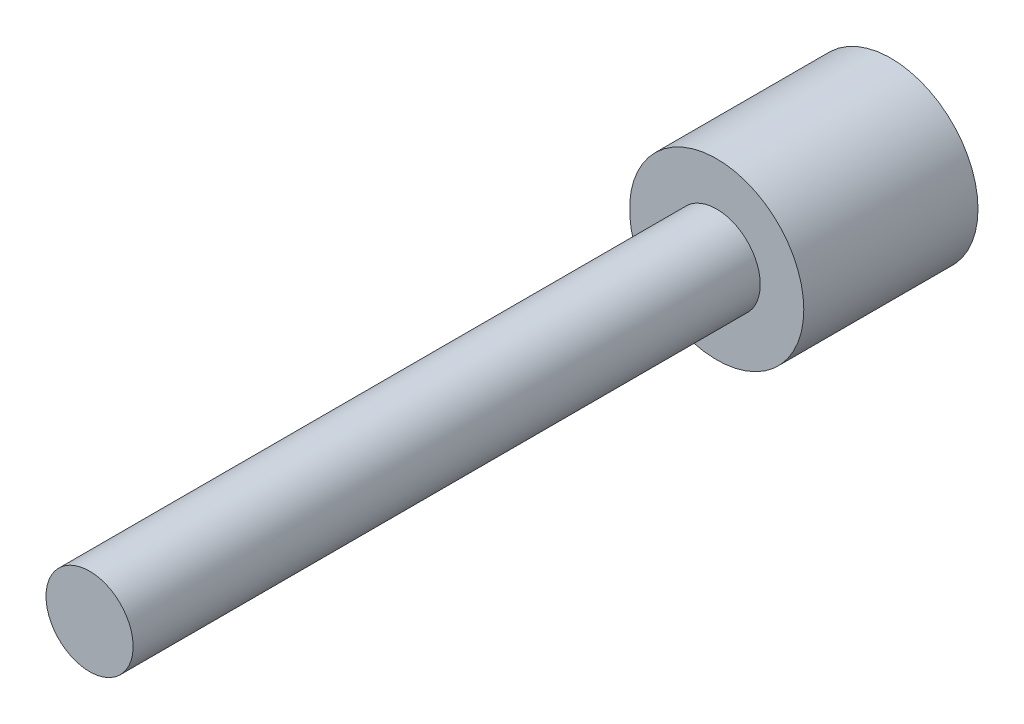
ISO-10303-21;
HEADER;
FILE_DESCRIPTION(('STEP AP214'),'2;1');
FILE_NAME('part.step','',(''),(''),'','','');
FILE_SCHEMA(('AUTOMOTIVE_DESIGN { 1 0 10303 214 1 1 1 1 }'));
ENDSEC;
DATA;
#1=APPLICATION_CONTEXT('core data for automotive mechanical design processes');
#2=APPLICATION_PROTOCOL_DEFINITION('international standard','automotive_design',2000,#1);
#3=PRODUCT_CONTEXT('',#1,'mechanical');
#4=PRODUCT('Part','Part','',(#3));
#5=PRODUCT_RELATED_PRODUCT_CATEGORY('part','',(#4));
#6=PRODUCT_DEFINITION_FORMATION('','',#4);
#7=PRODUCT_DEFINITION_CONTEXT('part definition',#1,'design');
#8=PRODUCT_DEFINITION('design','',#6,#7);
#9=PRODUCT_DEFINITION_SHAPE('','',#8);
#10=(LENGTH_UNIT() NAMED_UNIT(*) SI_UNIT(.MILLI.,.METRE.));
#11=(NAMED_UNIT(*) PLANE_ANGLE_UNIT() SI_UNIT($,.RADIAN.));
#12=(NAMED_UNIT(*) SI_UNIT($,.STERADIAN.) SOLID_ANGLE_UNIT());
#13=UNCERTAINTY_MEASURE_WITH_UNIT(LENGTH_MEASURE(1.E-05),#10,'distance_accuracy_value','');
#14=(GEOMETRIC_REPRESENTATION_CONTEXT(3) GLOBAL_UNCERTAINTY_ASSIGNED_CONTEXT((#13)) GLOBAL_UNIT_ASSIGNED_CONTEXT((#10,
#11,#12)) REPRESENTATION_CONTEXT('',''));
#15=CARTESIAN_POINT('',(0.,0.,0.));
#16=DIRECTION('',(0.,0.,1.));
#17=DIRECTION('',(1.,0.,0.));
#18=AXIS2_PLACEMENT_3D('',#15,#16,#17);
#19=CARTESIAN_POINT('',(0.,0.,0.));
#20=DIRECTION('',(0.,0.,1.));
#21=DIRECTION('',(1.,0.,0.));
#22=AXIS2_PLACEMENT_3D('',#19,#20,#21);
#23=PLANE('',#22);
#24=CARTESIAN_POINT('',(0.,0.,0.));
#25=DIRECTION('',(0.,0.,-1.));
#26=DIRECTION('',(-1.,0.,0.));
#27=AXIS2_PLACEMENT_3D('',#24,#25,#26);
#28=CIRCLE('',#27,2.5);
#29=CARTESIAN_POINT('',(-2.5,0.,0.));
#30=VERTEX_POINT('',#29);
#31=EDGE_CURVE('E88',#30,#30,#28,.T.);
#32=ORIENTED_EDGE('',*,*,#31,.F.);
#33=EDGE_LOOP('',(#32));
#34=FACE_BOUND('',#33,.T.);
#35=CARTESIAN_POINT('',(0.,0.,0.));
#36=DIRECTION('',(0.,0.,1.));
#37=DIRECTION('',(1.,0.,0.));
#38=AXIS2_PLACEMENT_3D('',#35,#36,#37);
#39=CIRCLE('',#38,5.);
#40=CARTESIAN_POINT('',(5.,0.,0.));
#41=VERTEX_POINT('',#40);
#42=EDGE_CURVE('E78',#41,#41,#39,.T.);
#43=ORIENTED_EDGE('',*,*,#42,.F.);
#44=EDGE_LOOP('',(#43));
#45=FACE_BOUND('',#44,.T.);
#46=ADVANCED_FACE('F30',(#34,#45),#23,.F.);
#47=CARTESIAN_POINT('',(0.,0.,10.));
#48=DIRECTION('',(0.,0.,-1.));
#49=DIRECTION('',(-1.,0.,0.));
#50=AXIS2_PLACEMENT_3D('',#47,#48,#49);
#51=CYLINDRICAL_SURFACE('',#50,5.);
#52=CARTESIAN_POINT('',(0.,0.,10.));
#53=DIRECTION('',(0.,0.,1.));
#54=DIRECTION('',(1.,0.,0.));
#55=AXIS2_PLACEMENT_3D('',#52,#53,#54);
#56=CIRCLE('',#55,5.);
#57=CARTESIAN_POINT('',(5.,0.,10.));
#58=VERTEX_POINT('',#57);
#59=EDGE_CURVE('E34',#58,#58,#56,.T.);
#60=ORIENTED_EDGE('',*,*,#59,.F.);
#61=EDGE_LOOP('',(#60));
#62=FACE_BOUND('',#61,.T.);
#63=ORIENTED_EDGE('',*,*,#42,.T.);
#64=EDGE_LOOP('',(#63));
#65=FACE_BOUND('',#64,.T.);
#66=ADVANCED_FACE('F32',(#62,#65),#51,.T.);
#67=CARTESIAN_POINT('',(0.,0.,10.));
#68=DIRECTION('',(0.,0.,1.));
#69=DIRECTION('',(1.,0.,0.));
#70=AXIS2_PLACEMENT_3D('',#67,#68,#69);
#71=PLANE('',#70);
#72=CARTESIAN_POINT('',(0.,0.,10.));
#73=DIRECTION('',(0.,0.,1.));
#74=DIRECTION('',(1.,0.,0.));
#75=AXIS2_PLACEMENT_3D('',#72,#73,#74);
#76=CIRCLE('',#75,2.5);
#77=CARTESIAN_POINT('',(2.5,0.,10.));
#78=VERTEX_POINT('',#77);
#79=EDGE_CURVE('E11',#78,#78,#76,.T.);
#80=ORIENTED_EDGE('',*,*,#79,.F.);
#81=EDGE_LOOP('',(#80));
#82=FACE_BOUND('',#81,.T.);
#83=ORIENTED_EDGE('',*,*,#59,.T.);
#84=EDGE_LOOP('',(#83));
#85=FACE_BOUND('',#84,.T.);
#86=ADVANCED_FACE('F63',(#82,#85),#71,.T.);
#87=CARTESIAN_POINT('',(0.,0.,46.));
#88=DIRECTION('',(0.,0.,-1.));
#89=DIRECTION('',(-1.,0.,0.));
#90=AXIS2_PLACEMENT_3D('',#87,#88,#89);
#91=CYLINDRICAL_SURFACE('',#90,2.5);
#92=ORIENTED_EDGE('',*,*,#79,.T.);
#93=EDGE_LOOP('',(#92));
#94=FACE_BOUND('',#93,.T.);
#95=CARTESIAN_POINT('',(0.,0.,46.));
#96=DIRECTION('',(0.,0.,-1.));
#97=DIRECTION('',(-1.,0.,0.));
#98=AXIS2_PLACEMENT_3D('',#95,#96,#97);
#99=CIRCLE('',#98,2.5);
#100=CARTESIAN_POINT('',(-2.5,0.,46.));
#101=VERTEX_POINT('',#100);
#102=EDGE_CURVE('E80',#101,#101,#99,.T.);
#103=ORIENTED_EDGE('',*,*,#102,.T.);
#104=EDGE_LOOP('',(#103));
#105=FACE_BOUND('',#104,.T.);
#106=ADVANCED_FACE('F53',(#94,#105),#91,.T.);
#107=CARTESIAN_POINT('',(0.,0.,46.));
#108=DIRECTION('',(0.,0.,-1.));
#109=DIRECTION('',(-1.,0.,0.));
#110=AXIS2_PLACEMENT_3D('',#107,#108,#109);
#111=PLANE('',#110);
#112=ORIENTED_EDGE('',*,*,#102,.F.);
#113=EDGE_LOOP('',(#112));
#114=FACE_BOUND('',#113,.T.);
#115=ADVANCED_FACE('F44',(#114),#111,.F.);
#116=CARTESIAN_POINT('',(0.,0.,8.50215154756889));
#117=DIRECTION('',(0.,0.,-1.));
#118=DIRECTION('',(-1.,0.,0.));
#119=AXIS2_PLACEMENT_3D('',#116,#117,#118);
#120=CONICAL_SURFACE('',#119,0.,1.02974425867666);
#121=CARTESIAN_POINT('',(0.,0.,7.));
#122=DIRECTION('',(0.,0.,-1.));
#123=DIRECTION('',(-1.,0.,0.));
#124=AXIS2_PLACEMENT_3D('',#121,#122,#123);
#125=CIRCLE('',#124,2.5);
#126=CARTESIAN_POINT('',(-2.5,0.,7.));
#127=VERTEX_POINT('',#126);
#128=EDGE_CURVE('E84',#127,#127,#125,.T.);
#129=ORIENTED_EDGE('',*,*,#128,.T.);
#130=EDGE_LOOP('',(#129));
#131=FACE_BOUND('',#130,.T.);
#132=CARTESIAN_POINT('',(0.,0.,8.50215154756889));
#133=VERTEX_POINT('',#132);
#134=VERTEX_LOOP('',#133);
#135=FACE_BOUND('',#134,.T.);
#136=ADVANCED_FACE('F41',(#131,#135),#120,.F.);
#137=CARTESIAN_POINT('',(0.,0.,0.));
#138=DIRECTION('',(0.,0.,-1.));
#139=DIRECTION('',(-1.,0.,0.));
#140=AXIS2_PLACEMENT_3D('',#137,#138,#139);
#141=CYLINDRICAL_SURFACE('',#140,2.5);
#142=ORIENTED_EDGE('',*,*,#31,.T.);
#143=EDGE_LOOP('',(#142));
#144=FACE_BOUND('',#143,.T.);
#145=ORIENTED_EDGE('',*,*,#128,.F.);
#146=EDGE_LOOP('',(#145));
#147=FACE_BOUND('',#146,.T.);
#148=ADVANCED_FACE('F43',(#144,#147),#141,.F.);
#149=CLOSED_SHELL('',(#46,#66,#86,#106,#115,#136,#148));
#150=MANIFOLD_SOLID_BREP('B2',#149);
#151=ADVANCED_BREP_SHAPE_REPRESENTATION('',(#18,#150),#14);
#152=SHAPE_DEFINITION_REPRESENTATION(#9,#151);
ENDSEC;
END-ISO-10303-21;
